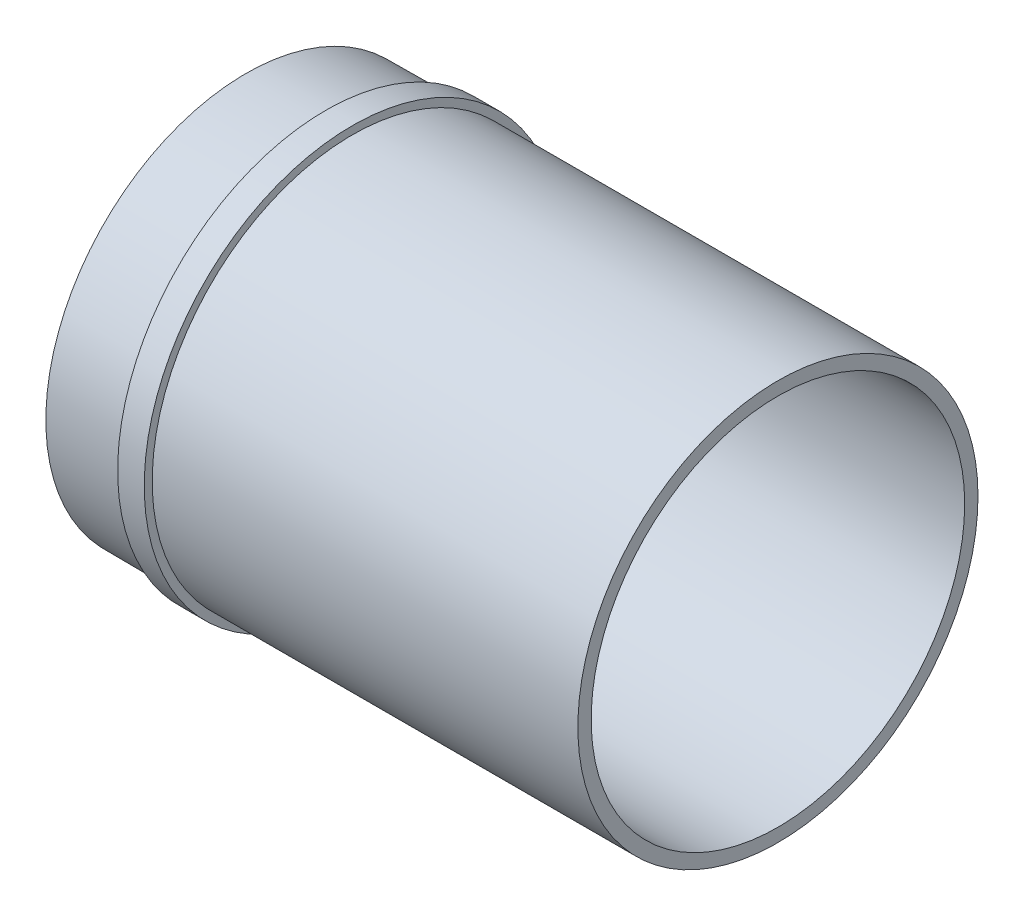
ISO-10303-21;
HEADER;
FILE_DESCRIPTION(('STEP AP214'),'2;1');
FILE_NAME('part.step','',(''),(''),'','','');
FILE_SCHEMA(('AUTOMOTIVE_DESIGN { 1 0 10303 214 1 1 1 1 }'));
ENDSEC;
DATA;
#1=APPLICATION_CONTEXT('core data for automotive mechanical design processes');
#2=APPLICATION_PROTOCOL_DEFINITION('international standard','automotive_design',2000,#1);
#3=PRODUCT_CONTEXT('',#1,'mechanical');
#4=PRODUCT('Part','Part','',(#3));
#5=PRODUCT_RELATED_PRODUCT_CATEGORY('part','',(#4));
#6=PRODUCT_DEFINITION_FORMATION('','',#4);
#7=PRODUCT_DEFINITION_CONTEXT('part definition',#1,'design');
#8=PRODUCT_DEFINITION('design','',#6,#7);
#9=PRODUCT_DEFINITION_SHAPE('','',#8);
#10=(LENGTH_UNIT() NAMED_UNIT(*) SI_UNIT(.MILLI.,.METRE.));
#11=(NAMED_UNIT(*) PLANE_ANGLE_UNIT() SI_UNIT($,.RADIAN.));
#12=(NAMED_UNIT(*) SI_UNIT($,.STERADIAN.) SOLID_ANGLE_UNIT());
#13=UNCERTAINTY_MEASURE_WITH_UNIT(LENGTH_MEASURE(1.E-05),#10,'distance_accuracy_value','');
#14=(GEOMETRIC_REPRESENTATION_CONTEXT(3) GLOBAL_UNCERTAINTY_ASSIGNED_CONTEXT((#13)) GLOBAL_UNIT_ASSIGNED_CONTEXT((#10,
#11,#12)) REPRESENTATION_CONTEXT('',''));
#15=CARTESIAN_POINT('',(0.,0.,0.));
#16=DIRECTION('',(0.,0.,1.));
#17=DIRECTION('',(1.,0.,0.));
#18=AXIS2_PLACEMENT_3D('',#15,#16,#17);
#19=CARTESIAN_POINT('',(-40.,0.,0.));
#20=DIRECTION('',(-1.,0.,0.));
#21=DIRECTION('',(0.,0.,1.));
#22=AXIS2_PLACEMENT_3D('',#19,#20,#21);
#23=PLANE('',#22);
#24=CARTESIAN_POINT('',(-40.,3557.29676158737,0.));
#25=DIRECTION('',(1.,0.,0.));
#26=DIRECTION('',(0.,0.,-1.));
#27=AXIS2_PLACEMENT_3D('',#24,#25,#26);
#28=CIRCLE('',#27,70.2032384127054);
#29=CARTESIAN_POINT('',(-40.,3557.29676158737,-70.2032384127054));
#30=VERTEX_POINT('',#29);
#31=EDGE_CURVE('E10',#30,#30,#28,.T.);
#32=ORIENTED_EDGE('',*,*,#31,.T.);
#33=EDGE_LOOP('',(#32));
#34=FACE_BOUND('',#33,.T.);
#35=CARTESIAN_POINT('',(-40.,3557.29676158737,0.));
#36=DIRECTION('',(1.,0.,0.));
#37=DIRECTION('',(0.,0.,-1.));
#38=AXIS2_PLACEMENT_3D('',#35,#36,#37);
#39=CIRCLE('',#38,75.1830098635295);
#40=CARTESIAN_POINT('',(-40.,3557.29676158737,-75.1830098635295));
#41=VERTEX_POINT('',#40);
#42=EDGE_CURVE('E62',#41,#41,#39,.T.);
#43=ORIENTED_EDGE('',*,*,#42,.F.);
#44=EDGE_LOOP('',(#43));
#45=FACE_BOUND('',#44,.T.);
#46=ADVANCED_FACE('F34',(#34,#45),#23,.T.);
#47=CARTESIAN_POINT('',(0.,3557.29676158737,0.));
#48=DIRECTION('',(1.,0.,0.));
#49=DIRECTION('',(0.,0.,-1.));
#50=AXIS2_PLACEMENT_3D('',#47,#48,#49);
#51=CYLINDRICAL_SURFACE('',#50,70.2032384126667);
#52=CARTESIAN_POINT('',(160.,3557.29676158737,0.));
#53=DIRECTION('',(1.,0.,0.));
#54=DIRECTION('',(0.,0.,-1.));
#55=AXIS2_PLACEMENT_3D('',#52,#53,#54);
#56=CIRCLE('',#55,70.2032384126281);
#57=CARTESIAN_POINT('',(160.,3557.29676158737,-70.2032384126281));
#58=VERTEX_POINT('',#57);
#59=EDGE_CURVE('E40',#58,#58,#56,.T.);
#60=ORIENTED_EDGE('',*,*,#59,.T.);
#61=EDGE_LOOP('',(#60));
#62=FACE_BOUND('',#61,.T.);
#63=ORIENTED_EDGE('',*,*,#31,.F.);
#64=EDGE_LOOP('',(#63));
#65=FACE_BOUND('',#64,.T.);
#66=ADVANCED_FACE('F69',(#62,#65),#51,.F.);
#67=CARTESIAN_POINT('',(160.,0.,0.));
#68=DIRECTION('',(-1.,0.,0.));
#69=DIRECTION('',(0.,0.,1.));
#70=AXIS2_PLACEMENT_3D('',#67,#68,#69);
#71=PLANE('',#70);
#72=ORIENTED_EDGE('',*,*,#59,.F.);
#73=EDGE_LOOP('',(#72));
#74=FACE_BOUND('',#73,.T.);
#75=CARTESIAN_POINT('',(160.,3557.29676158737,0.));
#76=DIRECTION('',(1.,0.,0.));
#77=DIRECTION('',(0.,0.,-1.));
#78=AXIS2_PLACEMENT_3D('',#75,#76,#77);
#79=CIRCLE('',#78,75.203238412628);
#80=CARTESIAN_POINT('',(160.,3557.29676158737,-75.203238412628));
#81=VERTEX_POINT('',#80);
#82=EDGE_CURVE('E44',#81,#81,#79,.T.);
#83=ORIENTED_EDGE('',*,*,#82,.T.);
#84=EDGE_LOOP('',(#83));
#85=FACE_BOUND('',#84,.T.);
#86=ADVANCED_FACE('F73',(#74,#85),#71,.F.);
#87=CARTESIAN_POINT('',(0.,3557.29676158737,0.));
#88=DIRECTION('',(1.,0.,0.));
#89=DIRECTION('',(0.,0.,-1.));
#90=AXIS2_PLACEMENT_3D('',#87,#88,#89);
#91=CYLINDRICAL_SURFACE('',#90,75.203238412628);
#92=ORIENTED_EDGE('',*,*,#82,.F.);
#93=EDGE_LOOP('',(#92));
#94=FACE_BOUND('',#93,.T.);
#95=CARTESIAN_POINT('',(-4.44852949790243E-13,3557.29676158737,0.));
#96=DIRECTION('',(1.,0.,0.));
#97=DIRECTION('',(0.,0.,-1.));
#98=AXIS2_PLACEMENT_3D('',#95,#96,#97);
#99=CIRCLE('',#98,75.203238412628);
#100=CARTESIAN_POINT('',(-4.44852949790243E-13,3557.29676158737,-75.203238412628));
#101=VERTEX_POINT('',#100);
#102=EDGE_CURVE('E48',#101,#101,#99,.T.);
#103=ORIENTED_EDGE('',*,*,#102,.T.);
#104=EDGE_LOOP('',(#103));
#105=FACE_BOUND('',#104,.T.);
#106=ADVANCED_FACE('F77',(#94,#105),#91,.T.);
#107=CARTESIAN_POINT('',(-4.45036646810115E-13,0.,0.));
#108=DIRECTION('',(-1.,0.,0.));
#109=DIRECTION('',(0.,0.,1.));
#110=AXIS2_PLACEMENT_3D('',#107,#108,#109);
#111=PLANE('',#110);
#112=ORIENTED_EDGE('',*,*,#102,.F.);
#113=EDGE_LOOP('',(#112));
#114=FACE_BOUND('',#113,.T.);
#115=CARTESIAN_POINT('',(-4.45220343829988E-13,3557.29676158737,0.));
#116=DIRECTION('',(1.,0.,0.));
#117=DIRECTION('',(0.,0.,-1.));
#118=AXIS2_PLACEMENT_3D('',#115,#116,#117);
#119=CIRCLE('',#118,78.2032384126281);
#120=CARTESIAN_POINT('',(-4.45220343829988E-13,3557.29676158737,-78.2032384126281));
#121=VERTEX_POINT('',#120);
#122=EDGE_CURVE('E53',#121,#121,#119,.T.);
#123=ORIENTED_EDGE('',*,*,#122,.T.);
#124=EDGE_LOOP('',(#123));
#125=FACE_BOUND('',#124,.T.);
#126=ADVANCED_FACE('F84',(#114,#125),#111,.F.);
#127=CARTESIAN_POINT('',(0.,3557.29676158737,0.));
#128=DIRECTION('',(1.,0.,0.));
#129=DIRECTION('',(0.,0.,-1.));
#130=AXIS2_PLACEMENT_3D('',#127,#128,#129);
#131=DEGENERATE_TOROIDAL_SURFACE('',#130,3557.29676158737,3635.5,.F.);
#132=CARTESIAN_POINT('',(-10.,3557.29676158737,0.));
#133=DIRECTION('',(1.,0.,0.));
#134=DIRECTION('',(0.,0.,-1.));
#135=AXIS2_PLACEMENT_3D('',#132,#133,#134);
#136=CIRCLE('',#135,78.1894851202125);
#137=CARTESIAN_POINT('',(-10.,3557.29676158737,-78.1894851202125));
#138=VERTEX_POINT('',#137);
#139=EDGE_CURVE('E56',#138,#138,#136,.T.);
#140=ORIENTED_EDGE('',*,*,#139,.T.);
#141=EDGE_LOOP('',(#140));
#142=FACE_BOUND('',#141,.T.);
#143=ORIENTED_EDGE('',*,*,#122,.F.);
#144=EDGE_LOOP('',(#143));
#145=FACE_BOUND('',#144,.T.);
#146=ADVANCED_FACE('F88',(#142,#145),#131,.F.);
#147=CARTESIAN_POINT('',(-10.,0.,0.));
#148=DIRECTION('',(1.,0.,0.));
#149=DIRECTION('',(0.,0.,-1.));
#150=AXIS2_PLACEMENT_3D('',#147,#148,#149);
#151=PLANE('',#150);
#152=ORIENTED_EDGE('',*,*,#139,.F.);
#153=EDGE_LOOP('',(#152));
#154=FACE_BOUND('',#153,.T.);
#155=CARTESIAN_POINT('',(-10.,3557.29676158737,0.));
#156=DIRECTION('',(1.,0.,0.));
#157=DIRECTION('',(0.,0.,-1.));
#158=AXIS2_PLACEMENT_3D('',#155,#156,#157);
#159=CIRCLE('',#158,75.3894745194561);
#160=CARTESIAN_POINT('',(-10.,3557.29676158737,-75.3894745194561));
#161=VERTEX_POINT('',#160);
#162=EDGE_CURVE('E59',#161,#161,#159,.T.);
#163=ORIENTED_EDGE('',*,*,#162,.T.);
#164=EDGE_LOOP('',(#163));
#165=FACE_BOUND('',#164,.T.);
#166=ADVANCED_FACE('F92',(#154,#165),#151,.F.);
#167=CARTESIAN_POINT('',(0.,3557.29676158737,0.));
#168=DIRECTION('',(1.,0.,0.));
#169=DIRECTION('',(0.,0.,-1.));
#170=AXIS2_PLACEMENT_3D('',#167,#168,#169);
#171=DEGENERATE_TOROIDAL_SURFACE('',#170,3557.29676158737,3632.7,.F.);
#172=ORIENTED_EDGE('',*,*,#162,.F.);
#173=EDGE_LOOP('',(#172));
#174=FACE_BOUND('',#173,.T.);
#175=ORIENTED_EDGE('',*,*,#42,.T.);
#176=EDGE_LOOP('',(#175));
#177=FACE_BOUND('',#176,.T.);
#178=ADVANCED_FACE('F66',(#174,#177),#171,.F.);
#179=CLOSED_SHELL('',(#46,#66,#86,#106,#126,#146,#166,#178));
#180=MANIFOLD_SOLID_BREP('B2',#179);
#181=ADVANCED_BREP_SHAPE_REPRESENTATION('',(#18,#180),#14);
#182=SHAPE_DEFINITION_REPRESENTATION(#9,#181);
ENDSEC;
END-ISO-10303-21;
